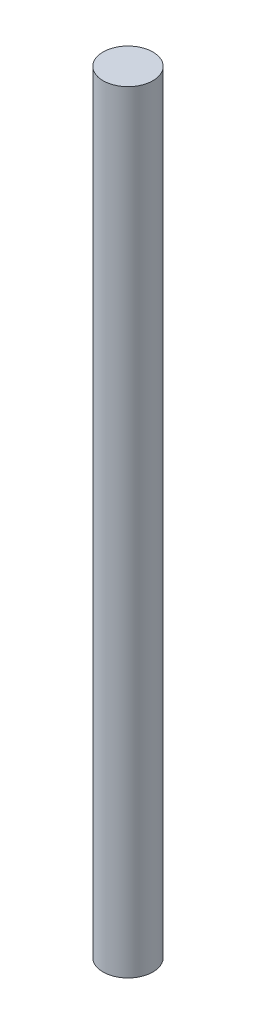
ISO-10303-21;
HEADER;
FILE_DESCRIPTION(('STEP AP214'),'2;1');
FILE_NAME('part.step','',(''),(''),'','','');
FILE_SCHEMA(('AUTOMOTIVE_DESIGN { 1 0 10303 214 1 1 1 1 }'));
ENDSEC;
DATA;
#1=APPLICATION_CONTEXT('core data for automotive mechanical design processes');
#2=APPLICATION_PROTOCOL_DEFINITION('international standard','automotive_design',2000,#1);
#3=PRODUCT_CONTEXT('',#1,'mechanical');
#4=PRODUCT('Part','Part','',(#3));
#5=PRODUCT_RELATED_PRODUCT_CATEGORY('part','',(#4));
#6=PRODUCT_DEFINITION_FORMATION('','',#4);
#7=PRODUCT_DEFINITION_CONTEXT('part definition',#1,'design');
#8=PRODUCT_DEFINITION('design','',#6,#7);
#9=PRODUCT_DEFINITION_SHAPE('','',#8);
#10=(LENGTH_UNIT() NAMED_UNIT(*) SI_UNIT(.MILLI.,.METRE.));
#11=(NAMED_UNIT(*) PLANE_ANGLE_UNIT() SI_UNIT($,.RADIAN.));
#12=(NAMED_UNIT(*) SI_UNIT($,.STERADIAN.) SOLID_ANGLE_UNIT());
#13=UNCERTAINTY_MEASURE_WITH_UNIT(LENGTH_MEASURE(1.E-05),#10,'distance_accuracy_value','');
#14=(GEOMETRIC_REPRESENTATION_CONTEXT(3) GLOBAL_UNCERTAINTY_ASSIGNED_CONTEXT((#13)) GLOBAL_UNIT_ASSIGNED_CONTEXT((#10,
#11,#12)) REPRESENTATION_CONTEXT('',''));
#15=CARTESIAN_POINT('',(0.,0.,0.));
#16=DIRECTION('',(0.,0.,1.));
#17=DIRECTION('',(1.,0.,0.));
#18=AXIS2_PLACEMENT_3D('',#15,#16,#17);
#19=CARTESIAN_POINT('',(0.,62.,0.));
#20=DIRECTION('',(0.,-1.,0.));
#21=DIRECTION('',(0.,0.,-1.));
#22=AXIS2_PLACEMENT_3D('',#19,#20,#21);
#23=CYLINDRICAL_SURFACE('',#22,2.);
#24=CARTESIAN_POINT('',(0.,62.,0.));
#25=DIRECTION('',(0.,1.,0.));
#26=DIRECTION('',(0.,0.,1.));
#27=AXIS2_PLACEMENT_3D('',#24,#25,#26);
#28=CIRCLE('',#27,2.);
#29=CARTESIAN_POINT('',(0.,62.,2.));
#30=VERTEX_POINT('',#29);
#31=EDGE_CURVE('E10',#30,#30,#28,.T.);
#32=ORIENTED_EDGE('',*,*,#31,.F.);
#33=EDGE_LOOP('',(#32));
#34=FACE_BOUND('',#33,.T.);
#35=CARTESIAN_POINT('',(0.,0.,0.));
#36=DIRECTION('',(0.,1.,0.));
#37=DIRECTION('',(0.,0.,1.));
#38=AXIS2_PLACEMENT_3D('',#35,#36,#37);
#39=CIRCLE('',#38,2.);
#40=CARTESIAN_POINT('',(0.,0.,2.));
#41=VERTEX_POINT('',#40);
#42=EDGE_CURVE('E36',#41,#41,#39,.T.);
#43=ORIENTED_EDGE('',*,*,#42,.T.);
#44=EDGE_LOOP('',(#43));
#45=FACE_BOUND('',#44,.T.);
#46=ADVANCED_FACE('F33',(#34,#45),#23,.T.);
#47=CARTESIAN_POINT('',(0.,62.,0.));
#48=DIRECTION('',(0.,1.,0.));
#49=DIRECTION('',(0.,0.,1.));
#50=AXIS2_PLACEMENT_3D('',#47,#48,#49);
#51=PLANE('',#50);
#52=ORIENTED_EDGE('',*,*,#31,.T.);
#53=EDGE_LOOP('',(#52));
#54=FACE_BOUND('',#53,.T.);
#55=ADVANCED_FACE('F48',(#54),#51,.T.);
#56=CARTESIAN_POINT('',(0.,0.,0.));
#57=DIRECTION('',(0.,1.,0.));
#58=DIRECTION('',(0.,0.,1.));
#59=AXIS2_PLACEMENT_3D('',#56,#57,#58);
#60=PLANE('',#59);
#61=ORIENTED_EDGE('',*,*,#42,.F.);
#62=EDGE_LOOP('',(#61));
#63=FACE_BOUND('',#62,.T.);
#64=ADVANCED_FACE('F46',(#63),#60,.F.);
#65=CLOSED_SHELL('',(#46,#55,#64));
#66=MANIFOLD_SOLID_BREP('B2',#65);
#67=ADVANCED_BREP_SHAPE_REPRESENTATION('',(#18,#66),#14);
#68=SHAPE_DEFINITION_REPRESENTATION(#9,#67);
ENDSEC;
END-ISO-10303-21;
